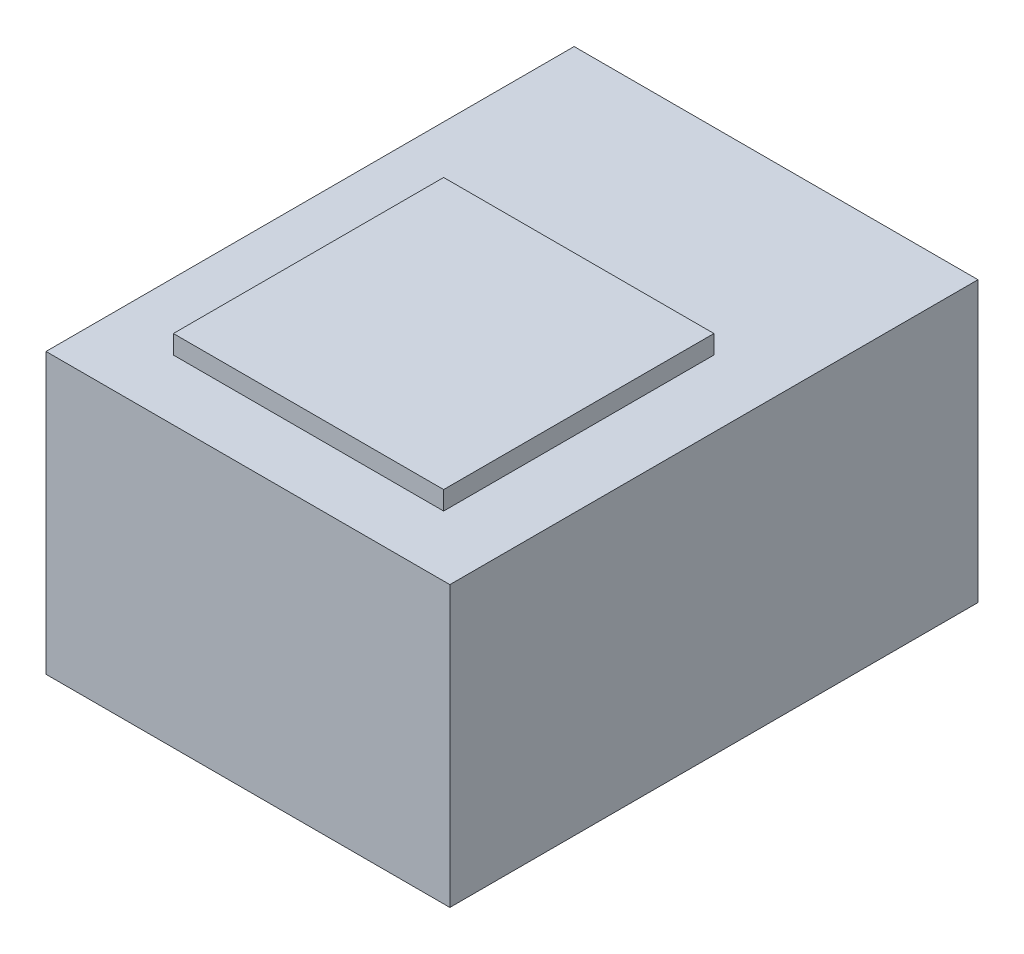
ISO-10303-21;
HEADER;
FILE_DESCRIPTION(('STEP AP214'),'2;1');
FILE_NAME('part.step','',(''),(''),'','','');
FILE_SCHEMA(('AUTOMOTIVE_DESIGN { 1 0 10303 214 1 1 1 1 }'));
ENDSEC;
DATA;
#1=APPLICATION_CONTEXT('core data for automotive mechanical design processes');
#2=APPLICATION_PROTOCOL_DEFINITION('international standard','automotive_design',2000,#1);
#3=PRODUCT_CONTEXT('',#1,'mechanical');
#4=PRODUCT('Part','Part','',(#3));
#5=PRODUCT_RELATED_PRODUCT_CATEGORY('part','',(#4));
#6=PRODUCT_DEFINITION_FORMATION('','',#4);
#7=PRODUCT_DEFINITION_CONTEXT('part definition',#1,'design');
#8=PRODUCT_DEFINITION('design','',#6,#7);
#9=PRODUCT_DEFINITION_SHAPE('','',#8);
#10=(LENGTH_UNIT() NAMED_UNIT(*) SI_UNIT(.MILLI.,.METRE.));
#11=(NAMED_UNIT(*) PLANE_ANGLE_UNIT() SI_UNIT($,.RADIAN.));
#12=(NAMED_UNIT(*) SI_UNIT($,.STERADIAN.) SOLID_ANGLE_UNIT());
#13=UNCERTAINTY_MEASURE_WITH_UNIT(LENGTH_MEASURE(1.E-05),#10,'distance_accuracy_value','');
#14=(GEOMETRIC_REPRESENTATION_CONTEXT(3) GLOBAL_UNCERTAINTY_ASSIGNED_CONTEXT((#13)) GLOBAL_UNIT_ASSIGNED_CONTEXT((#10,
#11,#12)) REPRESENTATION_CONTEXT('',''));
#15=CARTESIAN_POINT('',(0.,0.,0.));
#16=DIRECTION('',(0.,0.,1.));
#17=DIRECTION('',(1.,0.,0.));
#18=AXIS2_PLACEMENT_3D('',#15,#16,#17);
#19=CARTESIAN_POINT('',(0.,0.,0.));
#20=DIRECTION('',(0.,1.,0.));
#21=DIRECTION('',(0.,0.,-1.));
#22=AXIS2_PLACEMENT_3D('',#19,#20,#21);
#23=PLANE('',#22);
#24=DIRECTION('',(0.,0.,-1.));
#25=VECTOR('',#24,1.);
#26=CARTESIAN_POINT('',(-0.125,0.,-0.786372602362917));
#27=LINE('',#26,#25);
#28=CARTESIAN_POINT('',(-0.124999999999999,0.,0.713627397637083));
#29=VERTEX_POINT('',#28);
#30=CARTESIAN_POINT('',(-0.125,0.,-0.786372602362917));
#31=VERTEX_POINT('',#30);
#32=EDGE_CURVE('E207',#29,#31,#27,.T.);
#33=ORIENTED_EDGE('',*,*,#32,.T.);
#34=DIRECTION('',(-1.,0.,0.));
#35=VECTOR('',#34,1.);
#36=CARTESIAN_POINT('',(-0.525,0.,-0.786372602362917));
#37=LINE('',#36,#35);
#38=CARTESIAN_POINT('',(-0.525,0.,-0.786372602362917));
#39=VERTEX_POINT('',#38);
#40=EDGE_CURVE('E223',#31,#39,#37,.T.);
#41=ORIENTED_EDGE('',*,*,#40,.T.);
#42=DIRECTION('',(0.,0.,1.));
#43=VECTOR('',#42,1.);
#44=CARTESIAN_POINT('',(-0.525,0.,-0.786372602362917));
#45=LINE('',#44,#43);
#46=CARTESIAN_POINT('',(-0.524999999999999,0.,0.713627397637083));
#47=VERTEX_POINT('',#46);
#48=EDGE_CURVE('E226',#39,#47,#45,.T.);
#49=ORIENTED_EDGE('',*,*,#48,.T.);
#50=DIRECTION('',(1.,0.,0.));
#51=VECTOR('',#50,1.);
#52=CARTESIAN_POINT('',(-0.524999999999999,0.,0.713627397637083));
#53=LINE('',#52,#51);
#54=EDGE_CURVE('E212',#47,#29,#53,.T.);
#55=ORIENTED_EDGE('',*,*,#54,.T.);
#56=EDGE_LOOP('',(#33,#41,#49,#55));
#57=FACE_BOUND('',#56,.T.);
#58=DIRECTION('',(0.,0.,1.));
#59=VECTOR('',#58,1.);
#60=CARTESIAN_POINT('',(0.65,0.,0.85));
#61=LINE('',#60,#59);
#62=CARTESIAN_POINT('',(0.65,0.,-0.85));
#63=VERTEX_POINT('',#62);
#64=CARTESIAN_POINT('',(0.65,0.,0.85));
#65=VERTEX_POINT('',#64);
#66=EDGE_CURVE('E238',#63,#65,#61,.T.);
#67=ORIENTED_EDGE('',*,*,#66,.T.);
#68=DIRECTION('',(-1.,0.,0.));
#69=VECTOR('',#68,1.);
#70=CARTESIAN_POINT('',(-0.65,0.,0.85));
#71=LINE('',#70,#69);
#72=CARTESIAN_POINT('',(-0.65,0.,0.85));
#73=VERTEX_POINT('',#72);
#74=EDGE_CURVE('E254',#65,#73,#71,.T.);
#75=ORIENTED_EDGE('',*,*,#74,.T.);
#76=DIRECTION('',(0.,0.,-1.));
#77=VECTOR('',#76,1.);
#78=CARTESIAN_POINT('',(-0.65,0.,0.85));
#79=LINE('',#78,#77);
#80=CARTESIAN_POINT('',(-0.65,0.,-0.85));
#81=VERTEX_POINT('',#80);
#82=EDGE_CURVE('E257',#73,#81,#79,.T.);
#83=ORIENTED_EDGE('',*,*,#82,.T.);
#84=DIRECTION('',(1.,0.,0.));
#85=VECTOR('',#84,1.);
#86=CARTESIAN_POINT('',(-0.65,0.,-0.85));
#87=LINE('',#86,#85);
#88=EDGE_CURVE('E243',#81,#63,#87,.T.);
#89=ORIENTED_EDGE('',*,*,#88,.T.);
#90=EDGE_LOOP('',(#67,#75,#83,#89));
#91=FACE_BOUND('',#90,.T.);
#92=DIRECTION('',(0.,0.,-1.));
#93=VECTOR('',#92,1.);
#94=CARTESIAN_POINT('',(0.525,0.,-0.786372602362917));
#95=LINE('',#94,#93);
#96=CARTESIAN_POINT('',(0.525,0.,0.713627397637083));
#97=VERTEX_POINT('',#96);
#98=CARTESIAN_POINT('',(0.525,0.,-0.786372602362917));
#99=VERTEX_POINT('',#98);
#100=EDGE_CURVE('E189',#97,#99,#95,.T.);
#101=ORIENTED_EDGE('',*,*,#100,.T.);
#102=DIRECTION('',(-1.,0.,0.));
#103=VECTOR('',#102,1.);
#104=CARTESIAN_POINT('',(0.125,0.,-0.786372602362917));
#105=LINE('',#104,#103);
#106=CARTESIAN_POINT('',(0.125,0.,-0.786372602362917));
#107=VERTEX_POINT('',#106);
#108=EDGE_CURVE('E192',#99,#107,#105,.T.);
#109=ORIENTED_EDGE('',*,*,#108,.T.);
#110=DIRECTION('',(0.,0.,1.));
#111=VECTOR('',#110,1.);
#112=CARTESIAN_POINT('',(0.125,0.,-0.786372602362917));
#113=LINE('',#112,#111);
#114=CARTESIAN_POINT('',(0.125000000000001,0.,0.713627397637083));
#115=VERTEX_POINT('',#114);
#116=EDGE_CURVE('E195',#107,#115,#113,.T.);
#117=ORIENTED_EDGE('',*,*,#116,.T.);
#118=DIRECTION('',(1.,0.,0.));
#119=VECTOR('',#118,1.);
#120=CARTESIAN_POINT('',(0.125000000000001,0.,0.713627397637083));
#121=LINE('',#120,#119);
#122=EDGE_CURVE('E180',#115,#97,#121,.T.);
#123=ORIENTED_EDGE('',*,*,#122,.T.);
#124=EDGE_LOOP('',(#101,#109,#117,#123));
#125=FACE_BOUND('',#124,.T.);
#126=ADVANCED_FACE('F37',(#57,#91,#125),#23,.F.);
#127=CARTESIAN_POINT('',(0.65,0.9,0.85));
#128=DIRECTION('',(-1.,0.,0.));
#129=DIRECTION('',(0.,0.,-1.));
#130=AXIS2_PLACEMENT_3D('',#127,#128,#129);
#131=PLANE('',#130);
#132=ORIENTED_EDGE('',*,*,#66,.F.);
#133=DIRECTION('',(0.,-1.,0.));
#134=VECTOR('',#133,1.);
#135=CARTESIAN_POINT('',(0.65,0.9,-0.85));
#136=LINE('',#135,#134);
#137=CARTESIAN_POINT('',(0.65,0.9,-0.85));
#138=VERTEX_POINT('',#137);
#139=EDGE_CURVE('E251',#138,#63,#136,.T.);
#140=ORIENTED_EDGE('',*,*,#139,.F.);
#141=DIRECTION('',(0.,0.,1.));
#142=VECTOR('',#141,1.);
#143=CARTESIAN_POINT('',(0.65,0.9,0.85));
#144=LINE('',#143,#142);
#145=CARTESIAN_POINT('',(0.65,0.9,0.85));
#146=VERTEX_POINT('',#145);
#147=EDGE_CURVE('E239',#138,#146,#144,.T.);
#148=ORIENTED_EDGE('',*,*,#147,.T.);
#149=DIRECTION('',(0.,-1.,0.));
#150=VECTOR('',#149,1.);
#151=CARTESIAN_POINT('',(0.65,0.9,0.85));
#152=LINE('',#151,#150);
#153=EDGE_CURVE('E11',#146,#65,#152,.T.);
#154=ORIENTED_EDGE('',*,*,#153,.T.);
#155=EDGE_LOOP('',(#132,#140,#148,#154));
#156=FACE_BOUND('',#155,.T.);
#157=ADVANCED_FACE('F39',(#156),#131,.F.);
#158=CARTESIAN_POINT('',(-0.65,0.9,0.85));
#159=DIRECTION('',(0.,0.,-1.));
#160=DIRECTION('',(1.,0.,0.));
#161=AXIS2_PLACEMENT_3D('',#158,#159,#160);
#162=PLANE('',#161);
#163=ORIENTED_EDGE('',*,*,#74,.F.);
#164=ORIENTED_EDGE('',*,*,#153,.F.);
#165=DIRECTION('',(-1.,0.,0.));
#166=VECTOR('',#165,1.);
#167=CARTESIAN_POINT('',(-0.65,0.9,0.85));
#168=LINE('',#167,#166);
#169=CARTESIAN_POINT('',(-0.65,0.9,0.85));
#170=VERTEX_POINT('',#169);
#171=EDGE_CURVE('E242',#146,#170,#168,.T.);
#172=ORIENTED_EDGE('',*,*,#171,.T.);
#173=DIRECTION('',(0.,-1.,0.));
#174=VECTOR('',#173,1.);
#175=CARTESIAN_POINT('',(-0.65,0.9,0.85));
#176=LINE('',#175,#174);
#177=EDGE_CURVE('E45',#170,#73,#176,.T.);
#178=ORIENTED_EDGE('',*,*,#177,.T.);
#179=EDGE_LOOP('',(#163,#164,#172,#178));
#180=FACE_BOUND('',#179,.T.);
#181=ADVANCED_FACE('F268',(#180),#162,.F.);
#182=CARTESIAN_POINT('',(-0.65,0.9,0.85));
#183=DIRECTION('',(1.,0.,0.));
#184=DIRECTION('',(0.,0.,1.));
#185=AXIS2_PLACEMENT_3D('',#182,#183,#184);
#186=PLANE('',#185);
#187=ORIENTED_EDGE('',*,*,#82,.F.);
#188=ORIENTED_EDGE('',*,*,#177,.F.);
#189=DIRECTION('',(0.,0.,-1.));
#190=VECTOR('',#189,1.);
#191=CARTESIAN_POINT('',(-0.65,0.9,0.85));
#192=LINE('',#191,#190);
#193=CARTESIAN_POINT('',(-0.65,0.9,-0.85));
#194=VERTEX_POINT('',#193);
#195=EDGE_CURVE('E246',#170,#194,#192,.T.);
#196=ORIENTED_EDGE('',*,*,#195,.T.);
#197=DIRECTION('',(0.,-1.,0.));
#198=VECTOR('',#197,1.);
#199=CARTESIAN_POINT('',(-0.65,0.9,-0.85));
#200=LINE('',#199,#198);
#201=EDGE_CURVE('E263',#194,#81,#200,.T.);
#202=ORIENTED_EDGE('',*,*,#201,.T.);
#203=EDGE_LOOP('',(#187,#188,#196,#202));
#204=FACE_BOUND('',#203,.T.);
#205=ADVANCED_FACE('F271',(#204),#186,.F.);
#206=CARTESIAN_POINT('',(-0.65,0.9,-0.85));
#207=DIRECTION('',(0.,0.,1.));
#208=DIRECTION('',(-1.,0.,0.));
#209=AXIS2_PLACEMENT_3D('',#206,#207,#208);
#210=PLANE('',#209);
#211=ORIENTED_EDGE('',*,*,#88,.F.);
#212=ORIENTED_EDGE('',*,*,#201,.F.);
#213=DIRECTION('',(1.,0.,0.));
#214=VECTOR('',#213,1.);
#215=CARTESIAN_POINT('',(-0.65,0.9,-0.85));
#216=LINE('',#215,#214);
#217=EDGE_CURVE('E249',#194,#138,#216,.T.);
#218=ORIENTED_EDGE('',*,*,#217,.T.);
#219=ORIENTED_EDGE('',*,*,#139,.T.);
#220=EDGE_LOOP('',(#211,#212,#218,#219));
#221=FACE_BOUND('',#220,.T.);
#222=ADVANCED_FACE('F283',(#221),#210,.F.);
#223=CARTESIAN_POINT('',(0.,0.9,0.));
#224=DIRECTION('',(0.,1.,0.));
#225=DIRECTION('',(0.,0.,-1.));
#226=AXIS2_PLACEMENT_3D('',#223,#224,#225);
#227=PLANE('',#226);
#228=DIRECTION('',(1.,0.,0.));
#229=VECTOR('',#228,1.);
#230=CARTESIAN_POINT('',(-0.435,0.9,0.655));
#231=LINE('',#230,#229);
#232=CARTESIAN_POINT('',(-0.435,0.9,0.655));
#233=VERTEX_POINT('',#232);
#234=CARTESIAN_POINT('',(0.435,0.9,0.655));
#235=VERTEX_POINT('',#234);
#236=EDGE_CURVE('E170',#233,#235,#231,.T.);
#237=ORIENTED_EDGE('',*,*,#236,.F.);
#238=DIRECTION('',(0.,0.,-1.));
#239=VECTOR('',#238,1.);
#240=CARTESIAN_POINT('',(-0.435,0.9,0.655));
#241=LINE('',#240,#239);
#242=CARTESIAN_POINT('',(-0.435,0.9,-0.215));
#243=VERTEX_POINT('',#242);
#244=EDGE_CURVE('E166',#233,#243,#241,.T.);
#245=ORIENTED_EDGE('',*,*,#244,.T.);
#246=DIRECTION('',(1.,0.,0.));
#247=VECTOR('',#246,1.);
#248=CARTESIAN_POINT('',(-0.435,0.9,-0.215));
#249=LINE('',#248,#247);
#250=CARTESIAN_POINT('',(0.435,0.9,-0.215));
#251=VERTEX_POINT('',#250);
#252=EDGE_CURVE('E479',#243,#251,#249,.T.);
#253=ORIENTED_EDGE('',*,*,#252,.T.);
#254=DIRECTION('',(0.,0.,-1.));
#255=VECTOR('',#254,1.);
#256=CARTESIAN_POINT('',(0.435,0.9,0.655));
#257=LINE('',#256,#255);
#258=EDGE_CURVE('E481',#235,#251,#257,.T.);
#259=ORIENTED_EDGE('',*,*,#258,.F.);
#260=EDGE_LOOP('',(#237,#245,#253,#259));
#261=FACE_BOUND('',#260,.T.);
#262=ORIENTED_EDGE('',*,*,#147,.F.);
#263=ORIENTED_EDGE('',*,*,#217,.F.);
#264=ORIENTED_EDGE('',*,*,#195,.F.);
#265=ORIENTED_EDGE('',*,*,#171,.F.);
#266=EDGE_LOOP('',(#262,#263,#264,#265));
#267=FACE_BOUND('',#266,.T.);
#268=ADVANCED_FACE('F281',(#261,#267),#227,.T.);
#269=CARTESIAN_POINT('',(-0.125,-0.06,-0.786372602362917));
#270=DIRECTION('',(-1.,0.,0.));
#271=DIRECTION('',(0.,0.,-1.));
#272=AXIS2_PLACEMENT_3D('',#269,#270,#271);
#273=PLANE('',#272);
#274=ORIENTED_EDGE('',*,*,#32,.F.);
#275=DIRECTION('',(0.,1.,0.));
#276=VECTOR('',#275,1.);
#277=CARTESIAN_POINT('',(-0.124999999999999,-0.06,0.713627397637083));
#278=LINE('',#277,#276);
#279=CARTESIAN_POINT('',(-0.124999999999999,-0.06,0.713627397637083));
#280=VERTEX_POINT('',#279);
#281=EDGE_CURVE('E220',#280,#29,#278,.T.);
#282=ORIENTED_EDGE('',*,*,#281,.F.);
#283=DIRECTION('',(0.,0.,-1.));
#284=VECTOR('',#283,1.);
#285=CARTESIAN_POINT('',(-0.125,-0.06,-0.786372602362917));
#286=LINE('',#285,#284);
#287=CARTESIAN_POINT('',(-0.125,-0.06,-0.786372602362917));
#288=VERTEX_POINT('',#287);
#289=EDGE_CURVE('E208',#280,#288,#286,.T.);
#290=ORIENTED_EDGE('',*,*,#289,.T.);
#291=DIRECTION('',(0.,1.,0.));
#292=VECTOR('',#291,1.);
#293=CARTESIAN_POINT('',(-0.125,-0.06,-0.786372602362917));
#294=LINE('',#293,#292);
#295=EDGE_CURVE('E236',#288,#31,#294,.T.);
#296=ORIENTED_EDGE('',*,*,#295,.T.);
#297=EDGE_LOOP('',(#274,#282,#290,#296));
#298=FACE_BOUND('',#297,.T.);
#299=ADVANCED_FACE('F290',(#298),#273,.F.);
#300=CARTESIAN_POINT('',(-0.525,-0.06,-0.786372602362917));
#301=DIRECTION('',(0.,0.,1.));
#302=DIRECTION('',(-1.,0.,0.));
#303=AXIS2_PLACEMENT_3D('',#300,#301,#302);
#304=PLANE('',#303);
#305=ORIENTED_EDGE('',*,*,#40,.F.);
#306=ORIENTED_EDGE('',*,*,#295,.F.);
#307=DIRECTION('',(-1.,0.,0.));
#308=VECTOR('',#307,1.);
#309=CARTESIAN_POINT('',(-0.525,-0.06,-0.786372602362917));
#310=LINE('',#309,#308);
#311=CARTESIAN_POINT('',(-0.525,-0.06,-0.786372602362917));
#312=VERTEX_POINT('',#311);
#313=EDGE_CURVE('E211',#288,#312,#310,.T.);
#314=ORIENTED_EDGE('',*,*,#313,.T.);
#315=DIRECTION('',(0.,1.,0.));
#316=VECTOR('',#315,1.);
#317=CARTESIAN_POINT('',(-0.525,-0.06,-0.786372602362917));
#318=LINE('',#317,#316);
#319=EDGE_CURVE('E234',#312,#39,#318,.T.);
#320=ORIENTED_EDGE('',*,*,#319,.T.);
#321=EDGE_LOOP('',(#305,#306,#314,#320));
#322=FACE_BOUND('',#321,.T.);
#323=ADVANCED_FACE('F303',(#322),#304,.F.);
#324=CARTESIAN_POINT('',(-0.525,-0.06,-0.786372602362917));
#325=DIRECTION('',(1.,0.,0.));
#326=DIRECTION('',(0.,0.,1.));
#327=AXIS2_PLACEMENT_3D('',#324,#325,#326);
#328=PLANE('',#327);
#329=ORIENTED_EDGE('',*,*,#48,.F.);
#330=ORIENTED_EDGE('',*,*,#319,.F.);
#331=DIRECTION('',(0.,0.,1.));
#332=VECTOR('',#331,1.);
#333=CARTESIAN_POINT('',(-0.525,-0.06,-0.786372602362917));
#334=LINE('',#333,#332);
#335=CARTESIAN_POINT('',(-0.524999999999999,-0.06,0.713627397637083));
#336=VERTEX_POINT('',#335);
#337=EDGE_CURVE('E215',#312,#336,#334,.T.);
#338=ORIENTED_EDGE('',*,*,#337,.T.);
#339=DIRECTION('',(0.,1.,0.));
#340=VECTOR('',#339,1.);
#341=CARTESIAN_POINT('',(-0.524999999999999,-0.06,0.713627397637083));
#342=LINE('',#341,#340);
#343=EDGE_CURVE('E232',#336,#47,#342,.T.);
#344=ORIENTED_EDGE('',*,*,#343,.T.);
#345=EDGE_LOOP('',(#329,#330,#338,#344));
#346=FACE_BOUND('',#345,.T.);
#347=ADVANCED_FACE('F307',(#346),#328,.F.);
#348=CARTESIAN_POINT('',(-0.524999999999999,-0.06,0.713627397637083));
#349=DIRECTION('',(0.,0.,-1.));
#350=DIRECTION('',(1.,0.,0.));
#351=AXIS2_PLACEMENT_3D('',#348,#349,#350);
#352=PLANE('',#351);
#353=ORIENTED_EDGE('',*,*,#54,.F.);
#354=ORIENTED_EDGE('',*,*,#343,.F.);
#355=DIRECTION('',(1.,0.,0.));
#356=VECTOR('',#355,1.);
#357=CARTESIAN_POINT('',(-0.524999999999999,-0.06,0.713627397637083));
#358=LINE('',#357,#356);
#359=EDGE_CURVE('E218',#336,#280,#358,.T.);
#360=ORIENTED_EDGE('',*,*,#359,.T.);
#361=ORIENTED_EDGE('',*,*,#281,.T.);
#362=EDGE_LOOP('',(#353,#354,#360,#361));
#363=FACE_BOUND('',#362,.T.);
#364=ADVANCED_FACE('F311',(#363),#352,.F.);
#365=CARTESIAN_POINT('',(0.,-0.06,0.));
#366=DIRECTION('',(0.,-1.,0.));
#367=DIRECTION('',(0.,0.,1.));
#368=AXIS2_PLACEMENT_3D('',#365,#366,#367);
#369=PLANE('',#368);
#370=ORIENTED_EDGE('',*,*,#289,.F.);
#371=ORIENTED_EDGE('',*,*,#359,.F.);
#372=ORIENTED_EDGE('',*,*,#337,.F.);
#373=ORIENTED_EDGE('',*,*,#313,.F.);
#374=EDGE_LOOP('',(#370,#371,#372,#373));
#375=FACE_BOUND('',#374,.T.);
#376=ADVANCED_FACE('F315',(#375),#369,.T.);
#377=CARTESIAN_POINT('',(0.525,-0.06,-0.786372602362917));
#378=DIRECTION('',(-1.,0.,0.));
#379=DIRECTION('',(0.,0.,-1.));
#380=AXIS2_PLACEMENT_3D('',#377,#378,#379);
#381=PLANE('',#380);
#382=ORIENTED_EDGE('',*,*,#100,.F.);
#383=DIRECTION('',(0.,1.,0.));
#384=VECTOR('',#383,1.);
#385=CARTESIAN_POINT('',(0.525,-0.06,0.713627397637083));
#386=LINE('',#385,#384);
#387=CARTESIAN_POINT('',(0.525,-0.06,0.713627397637083));
#388=VERTEX_POINT('',#387);
#389=EDGE_CURVE('E188',#388,#97,#386,.T.);
#390=ORIENTED_EDGE('',*,*,#389,.F.);
#391=DIRECTION('',(0.,0.,-1.));
#392=VECTOR('',#391,1.);
#393=CARTESIAN_POINT('',(0.525,-0.06,-0.786372602362917));
#394=LINE('',#393,#392);
#395=CARTESIAN_POINT('',(0.525,-0.06,-0.786372602362917));
#396=VERTEX_POINT('',#395);
#397=EDGE_CURVE('E176',#388,#396,#394,.T.);
#398=ORIENTED_EDGE('',*,*,#397,.T.);
#399=DIRECTION('',(0.,1.,0.));
#400=VECTOR('',#399,1.);
#401=CARTESIAN_POINT('',(0.525,-0.06,-0.786372602362917));
#402=LINE('',#401,#400);
#403=EDGE_CURVE('E205',#396,#99,#402,.T.);
#404=ORIENTED_EDGE('',*,*,#403,.T.);
#405=EDGE_LOOP('',(#382,#390,#398,#404));
#406=FACE_BOUND('',#405,.T.);
#407=ADVANCED_FACE('F319',(#406),#381,.F.);
#408=CARTESIAN_POINT('',(0.125,-0.06,-0.786372602362917));
#409=DIRECTION('',(0.,0.,1.));
#410=DIRECTION('',(-1.,0.,0.));
#411=AXIS2_PLACEMENT_3D('',#408,#409,#410);
#412=PLANE('',#411);
#413=ORIENTED_EDGE('',*,*,#108,.F.);
#414=ORIENTED_EDGE('',*,*,#403,.F.);
#415=DIRECTION('',(-1.,0.,0.));
#416=VECTOR('',#415,1.);
#417=CARTESIAN_POINT('',(0.125,-0.06,-0.786372602362917));
#418=LINE('',#417,#416);
#419=CARTESIAN_POINT('',(0.125,-0.06,-0.786372602362917));
#420=VERTEX_POINT('',#419);
#421=EDGE_CURVE('E179',#396,#420,#418,.T.);
#422=ORIENTED_EDGE('',*,*,#421,.T.);
#423=DIRECTION('',(0.,1.,0.));
#424=VECTOR('',#423,1.);
#425=CARTESIAN_POINT('',(0.125,-0.06,-0.786372602362917));
#426=LINE('',#425,#424);
#427=EDGE_CURVE('E203',#420,#107,#426,.T.);
#428=ORIENTED_EDGE('',*,*,#427,.T.);
#429=EDGE_LOOP('',(#413,#414,#422,#428));
#430=FACE_BOUND('',#429,.T.);
#431=ADVANCED_FACE('F323',(#430),#412,.F.);
#432=CARTESIAN_POINT('',(0.125,-0.06,-0.786372602362917));
#433=DIRECTION('',(1.,0.,0.));
#434=DIRECTION('',(0.,0.,1.));
#435=AXIS2_PLACEMENT_3D('',#432,#433,#434);
#436=PLANE('',#435);
#437=ORIENTED_EDGE('',*,*,#116,.F.);
#438=ORIENTED_EDGE('',*,*,#427,.F.);
#439=DIRECTION('',(0.,0.,1.));
#440=VECTOR('',#439,1.);
#441=CARTESIAN_POINT('',(0.125,-0.06,-0.786372602362917));
#442=LINE('',#441,#440);
#443=CARTESIAN_POINT('',(0.125000000000001,-0.06,0.713627397637083));
#444=VERTEX_POINT('',#443);
#445=EDGE_CURVE('E183',#420,#444,#442,.T.);
#446=ORIENTED_EDGE('',*,*,#445,.T.);
#447=DIRECTION('',(0.,1.,0.));
#448=VECTOR('',#447,1.);
#449=CARTESIAN_POINT('',(0.125000000000001,-0.06,0.713627397637083));
#450=LINE('',#449,#448);
#451=EDGE_CURVE('E201',#444,#115,#450,.T.);
#452=ORIENTED_EDGE('',*,*,#451,.T.);
#453=EDGE_LOOP('',(#437,#438,#446,#452));
#454=FACE_BOUND('',#453,.T.);
#455=ADVANCED_FACE('F327',(#454),#436,.F.);
#456=CARTESIAN_POINT('',(0.125000000000001,-0.06,0.713627397637083));
#457=DIRECTION('',(0.,0.,-1.));
#458=DIRECTION('',(1.,0.,0.));
#459=AXIS2_PLACEMENT_3D('',#456,#457,#458);
#460=PLANE('',#459);
#461=ORIENTED_EDGE('',*,*,#122,.F.);
#462=ORIENTED_EDGE('',*,*,#451,.F.);
#463=DIRECTION('',(1.,0.,0.));
#464=VECTOR('',#463,1.);
#465=CARTESIAN_POINT('',(0.125000000000001,-0.06,0.713627397637083));
#466=LINE('',#465,#464);
#467=EDGE_CURVE('E186',#444,#388,#466,.T.);
#468=ORIENTED_EDGE('',*,*,#467,.T.);
#469=ORIENTED_EDGE('',*,*,#389,.T.);
#470=EDGE_LOOP('',(#461,#462,#468,#469));
#471=FACE_BOUND('',#470,.T.);
#472=ADVANCED_FACE('F331',(#471),#460,.F.);
#473=CARTESIAN_POINT('',(0.,-0.06,0.));
#474=DIRECTION('',(0.,-1.,0.));
#475=DIRECTION('',(0.,0.,1.));
#476=AXIS2_PLACEMENT_3D('',#473,#474,#475);
#477=PLANE('',#476);
#478=ORIENTED_EDGE('',*,*,#397,.F.);
#479=ORIENTED_EDGE('',*,*,#467,.F.);
#480=ORIENTED_EDGE('',*,*,#445,.F.);
#481=ORIENTED_EDGE('',*,*,#421,.F.);
#482=EDGE_LOOP('',(#478,#479,#480,#481));
#483=FACE_BOUND('',#482,.T.);
#484=ADVANCED_FACE('F335',(#483),#477,.T.);
#485=CARTESIAN_POINT('',(-0.435,0.96,0.655));
#486=DIRECTION('',(0.,0.,1.));
#487=DIRECTION('',(-1.,0.,0.));
#488=AXIS2_PLACEMENT_3D('',#485,#486,#487);
#489=PLANE('',#488);
#490=ORIENTED_EDGE('',*,*,#236,.T.);
#491=DIRECTION('',(0.,-1.,0.));
#492=VECTOR('',#491,1.);
#493=CARTESIAN_POINT('',(0.435,0.96,0.655));
#494=LINE('',#493,#492);
#495=CARTESIAN_POINT('',(0.435,0.96,0.655));
#496=VERTEX_POINT('',#495);
#497=EDGE_CURVE('E156',#496,#235,#494,.T.);
#498=ORIENTED_EDGE('',*,*,#497,.F.);
#499=DIRECTION('',(1.,0.,0.));
#500=VECTOR('',#499,1.);
#501=CARTESIAN_POINT('',(-0.435,0.96,0.655));
#502=LINE('',#501,#500);
#503=CARTESIAN_POINT('',(-0.435,0.96,0.655));
#504=VERTEX_POINT('',#503);
#505=EDGE_CURVE('E162',#504,#496,#502,.T.);
#506=ORIENTED_EDGE('',*,*,#505,.F.);
#507=DIRECTION('',(0.,-1.,0.));
#508=VECTOR('',#507,1.);
#509=CARTESIAN_POINT('',(-0.435,0.96,0.655));
#510=LINE('',#509,#508);
#511=EDGE_CURVE('E52',#504,#233,#510,.T.);
#512=ORIENTED_EDGE('',*,*,#511,.T.);
#513=EDGE_LOOP('',(#490,#498,#506,#512));
#514=FACE_BOUND('',#513,.T.);
#515=ADVANCED_FACE('F168',(#514),#489,.T.);
#516=CARTESIAN_POINT('',(-0.435,0.96,0.655));
#517=DIRECTION('',(1.,0.,0.));
#518=DIRECTION('',(0.,0.,1.));
#519=AXIS2_PLACEMENT_3D('',#516,#517,#518);
#520=PLANE('',#519);
#521=ORIENTED_EDGE('',*,*,#244,.F.);
#522=ORIENTED_EDGE('',*,*,#511,.F.);
#523=DIRECTION('',(0.,0.,-1.));
#524=VECTOR('',#523,1.);
#525=CARTESIAN_POINT('',(-0.435,0.96,0.655));
#526=LINE('',#525,#524);
#527=CARTESIAN_POINT('',(-0.435,0.96,-0.215));
#528=VERTEX_POINT('',#527);
#529=EDGE_CURVE('E165',#504,#528,#526,.T.);
#530=ORIENTED_EDGE('',*,*,#529,.T.);
#531=DIRECTION('',(0.,-1.,0.));
#532=VECTOR('',#531,1.);
#533=CARTESIAN_POINT('',(-0.435,0.96,-0.215));
#534=LINE('',#533,#532);
#535=EDGE_CURVE('E59',#528,#243,#534,.T.);
#536=ORIENTED_EDGE('',*,*,#535,.T.);
#537=EDGE_LOOP('',(#521,#522,#530,#536));
#538=FACE_BOUND('',#537,.T.);
#539=ADVANCED_FACE('F342',(#538),#520,.F.);
#540=CARTESIAN_POINT('',(-0.435,0.96,-0.215));
#541=DIRECTION('',(0.,0.,1.));
#542=DIRECTION('',(-1.,0.,0.));
#543=AXIS2_PLACEMENT_3D('',#540,#541,#542);
#544=PLANE('',#543);
#545=ORIENTED_EDGE('',*,*,#252,.F.);
#546=ORIENTED_EDGE('',*,*,#535,.F.);
#547=DIRECTION('',(1.,0.,0.));
#548=VECTOR('',#547,1.);
#549=CARTESIAN_POINT('',(-0.435,0.96,-0.215));
#550=LINE('',#549,#548);
#551=CARTESIAN_POINT('',(0.435,0.96,-0.215));
#552=VERTEX_POINT('',#551);
#553=EDGE_CURVE('E161',#528,#552,#550,.T.);
#554=ORIENTED_EDGE('',*,*,#553,.T.);
#555=DIRECTION('',(0.,-1.,0.));
#556=VECTOR('',#555,1.);
#557=CARTESIAN_POINT('',(0.435,0.96,-0.215));
#558=LINE('',#557,#556);
#559=EDGE_CURVE('E158',#552,#251,#558,.T.);
#560=ORIENTED_EDGE('',*,*,#559,.T.);
#561=EDGE_LOOP('',(#545,#546,#554,#560));
#562=FACE_BOUND('',#561,.T.);
#563=ADVANCED_FACE('F345',(#562),#544,.F.);
#564=CARTESIAN_POINT('',(0.435,0.96,0.655));
#565=DIRECTION('',(1.,0.,0.));
#566=DIRECTION('',(0.,0.,1.));
#567=AXIS2_PLACEMENT_3D('',#564,#565,#566);
#568=PLANE('',#567);
#569=ORIENTED_EDGE('',*,*,#258,.T.);
#570=ORIENTED_EDGE('',*,*,#559,.F.);
#571=DIRECTION('',(0.,0.,-1.));
#572=VECTOR('',#571,1.);
#573=CARTESIAN_POINT('',(0.435,0.96,0.655));
#574=LINE('',#573,#572);
#575=EDGE_CURVE('E151',#496,#552,#574,.T.);
#576=ORIENTED_EDGE('',*,*,#575,.F.);
#577=ORIENTED_EDGE('',*,*,#497,.T.);
#578=EDGE_LOOP('',(#569,#570,#576,#577));
#579=FACE_BOUND('',#578,.T.);
#580=ADVANCED_FACE('F154',(#579),#568,.T.);
#581=CARTESIAN_POINT('',(0.,0.96,0.));
#582=DIRECTION('',(0.,-1.,0.));
#583=DIRECTION('',(0.,0.,1.));
#584=AXIS2_PLACEMENT_3D('',#581,#582,#583);
#585=PLANE('',#584);
#586=ORIENTED_EDGE('',*,*,#505,.T.);
#587=ORIENTED_EDGE('',*,*,#575,.T.);
#588=ORIENTED_EDGE('',*,*,#553,.F.);
#589=ORIENTED_EDGE('',*,*,#529,.F.);
#590=EDGE_LOOP('',(#586,#587,#588,#589));
#591=FACE_BOUND('',#590,.T.);
#592=ADVANCED_FACE('F164',(#591),#585,.F.);
#593=CLOSED_SHELL('',(#126,#157,#181,#205,#222,#268,#299,#323,#347,#364,#376,#407,#431,#455,
#472,#484,#515,#539,#563,#580,#592));
#594=MANIFOLD_SOLID_BREP('B2',#593);
#595=ADVANCED_BREP_SHAPE_REPRESENTATION('',(#18,#594),#14);
#596=SHAPE_DEFINITION_REPRESENTATION(#9,#595);
ENDSEC;
END-ISO-10303-21;
